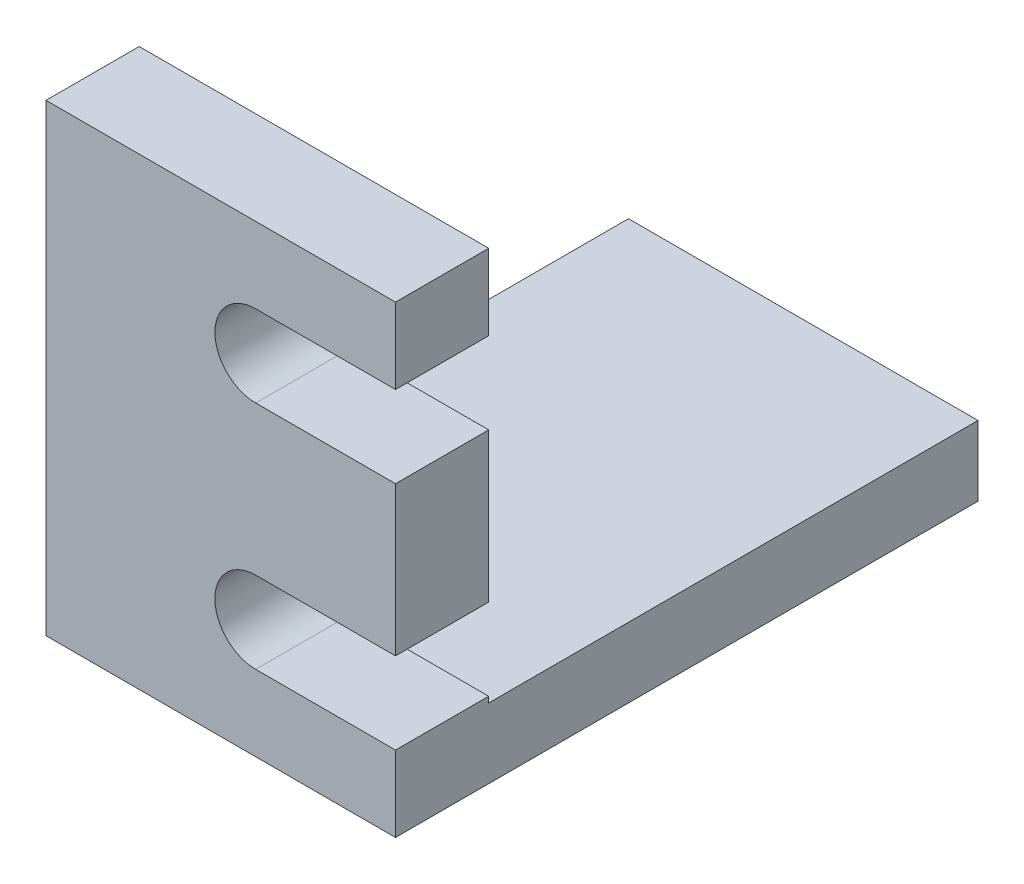
ISO-10303-21;
HEADER;
FILE_DESCRIPTION(('STEP AP214'),'2;1');
FILE_NAME('part.step','',(''),(''),'','','');
FILE_SCHEMA(('AUTOMOTIVE_DESIGN { 1 0 10303 214 1 1 1 1 }'));
ENDSEC;
DATA;
#1=APPLICATION_CONTEXT('core data for automotive mechanical design processes');
#2=APPLICATION_PROTOCOL_DEFINITION('international standard','automotive_design',2000,#1);
#3=PRODUCT_CONTEXT('',#1,'mechanical');
#4=PRODUCT('Part','Part','',(#3));
#5=PRODUCT_RELATED_PRODUCT_CATEGORY('part','',(#4));
#6=PRODUCT_DEFINITION_FORMATION('','',#4);
#7=PRODUCT_DEFINITION_CONTEXT('part definition',#1,'design');
#8=PRODUCT_DEFINITION('design','',#6,#7);
#9=PRODUCT_DEFINITION_SHAPE('','',#8);
#10=(LENGTH_UNIT() NAMED_UNIT(*) SI_UNIT(.MILLI.,.METRE.));
#11=(NAMED_UNIT(*) PLANE_ANGLE_UNIT() SI_UNIT($,.RADIAN.));
#12=(NAMED_UNIT(*) SI_UNIT($,.STERADIAN.) SOLID_ANGLE_UNIT());
#13=UNCERTAINTY_MEASURE_WITH_UNIT(LENGTH_MEASURE(1.E-05),#10,'distance_accuracy_value','');
#14=(GEOMETRIC_REPRESENTATION_CONTEXT(3) GLOBAL_UNCERTAINTY_ASSIGNED_CONTEXT((#13)) GLOBAL_UNIT_ASSIGNED_CONTEXT((#10,
#11,#12)) REPRESENTATION_CONTEXT('',''));
#15=CARTESIAN_POINT('',(0.,0.,0.));
#16=DIRECTION('',(0.,0.,1.));
#17=DIRECTION('',(1.,0.,0.));
#18=AXIS2_PLACEMENT_3D('',#15,#16,#17);
#19=CARTESIAN_POINT('',(0.,0.,0.));
#20=DIRECTION('',(0.,0.,1.));
#21=DIRECTION('',(1.,0.,0.));
#22=AXIS2_PLACEMENT_3D('',#19,#20,#21);
#23=PLANE('',#22);
#24=DIRECTION('',(1.,0.,0.));
#25=VECTOR('',#24,1.);
#26=CARTESIAN_POINT('',(15.,3.,0.));
#27=LINE('',#26,#25);
#28=CARTESIAN_POINT('',(0.,3.,0.));
#29=VERTEX_POINT('',#28);
#30=CARTESIAN_POINT('',(15.,3.,0.));
#31=VERTEX_POINT('',#30);
#32=EDGE_CURVE('E55',#29,#31,#27,.T.);
#33=ORIENTED_EDGE('',*,*,#32,.F.);
#34=DIRECTION('',(0.,1.,0.));
#35=VECTOR('',#34,1.);
#36=CARTESIAN_POINT('',(0.,0.,0.));
#37=LINE('',#36,#35);
#38=CARTESIAN_POINT('',(0.,19.9,0.));
#39=VERTEX_POINT('',#38);
#40=EDGE_CURVE('E275',#29,#39,#37,.T.);
#41=ORIENTED_EDGE('',*,*,#40,.T.);
#42=DIRECTION('',(1.,0.,0.));
#43=VECTOR('',#42,1.);
#44=CARTESIAN_POINT('',(0.,19.9,0.));
#45=LINE('',#44,#43);
#46=CARTESIAN_POINT('',(15.,19.9,0.));
#47=VERTEX_POINT('',#46);
#48=EDGE_CURVE('E268',#39,#47,#45,.T.);
#49=ORIENTED_EDGE('',*,*,#48,.T.);
#50=DIRECTION('',(0.,1.,0.));
#51=VECTOR('',#50,1.);
#52=CARTESIAN_POINT('',(15.,0.,0.));
#53=LINE('',#52,#51);
#54=CARTESIAN_POINT('',(15.,16.65,0.));
#55=VERTEX_POINT('',#54);
#56=EDGE_CURVE('E262',#55,#47,#53,.T.);
#57=ORIENTED_EDGE('',*,*,#56,.F.);
#58=DIRECTION('',(1.,0.,0.));
#59=VECTOR('',#58,1.);
#60=CARTESIAN_POINT('',(0.,16.65,0.));
#61=LINE('',#60,#59);
#62=CARTESIAN_POINT('',(9.,16.65,0.));
#63=VERTEX_POINT('',#62);
#64=EDGE_CURVE('E266',#63,#55,#61,.T.);
#65=ORIENTED_EDGE('',*,*,#64,.F.);
#66=CARTESIAN_POINT('',(9.,14.9,0.));
#67=DIRECTION('',(0.,0.,1.));
#68=DIRECTION('',(1.,0.,0.));
#69=AXIS2_PLACEMENT_3D('',#66,#67,#68);
#70=CIRCLE('',#69,1.75);
#71=CARTESIAN_POINT('',(9.,13.15,0.));
#72=VERTEX_POINT('',#71);
#73=EDGE_CURVE('E194',#63,#72,#70,.T.);
#74=ORIENTED_EDGE('',*,*,#73,.T.);
#75=DIRECTION('',(1.,0.,0.));
#76=VECTOR('',#75,1.);
#77=CARTESIAN_POINT('',(0.,13.15,0.));
#78=LINE('',#77,#76);
#79=CARTESIAN_POINT('',(15.,13.15,0.));
#80=VERTEX_POINT('',#79);
#81=EDGE_CURVE('E187',#72,#80,#78,.T.);
#82=ORIENTED_EDGE('',*,*,#81,.T.);
#83=CARTESIAN_POINT('',(15.,6.75,0.));
#84=VERTEX_POINT('',#83);
#85=EDGE_CURVE('E272',#84,#80,#53,.T.);
#86=ORIENTED_EDGE('',*,*,#85,.F.);
#87=DIRECTION('',(1.,0.,0.));
#88=VECTOR('',#87,1.);
#89=CARTESIAN_POINT('',(0.,6.75,0.));
#90=LINE('',#89,#88);
#91=CARTESIAN_POINT('',(9.,6.75,0.));
#92=VERTEX_POINT('',#91);
#93=EDGE_CURVE('E153',#92,#84,#90,.T.);
#94=ORIENTED_EDGE('',*,*,#93,.F.);
#95=CARTESIAN_POINT('',(9.,5.,0.));
#96=DIRECTION('',(0.,0.,1.));
#97=DIRECTION('',(1.,0.,0.));
#98=AXIS2_PLACEMENT_3D('',#95,#96,#97);
#99=CIRCLE('',#98,1.75);
#100=CARTESIAN_POINT('',(9.,3.25,0.));
#101=VERTEX_POINT('',#100);
#102=EDGE_CURVE('E285',#92,#101,#99,.T.);
#103=ORIENTED_EDGE('',*,*,#102,.T.);
#104=DIRECTION('',(1.,0.,0.));
#105=VECTOR('',#104,1.);
#106=CARTESIAN_POINT('',(0.,3.25,0.));
#107=LINE('',#106,#105);
#108=CARTESIAN_POINT('',(15.,3.25,0.));
#109=VERTEX_POINT('',#108);
#110=EDGE_CURVE('E279',#101,#109,#107,.T.);
#111=ORIENTED_EDGE('',*,*,#110,.T.);
#112=EDGE_CURVE('E271',#31,#109,#53,.T.);
#113=ORIENTED_EDGE('',*,*,#112,.F.);
#114=EDGE_LOOP('',(#33,#41,#49,#57,#65,#74,#82,#86,#94,#103,#111,#113));
#115=FACE_BOUND('',#114,.T.);
#116=ADVANCED_FACE('F39',(#115),#23,.F.);
#117=CARTESIAN_POINT('',(9.,14.9,4.));
#118=DIRECTION('',(0.,0.,-1.));
#119=DIRECTION('',(-1.,0.,0.));
#120=AXIS2_PLACEMENT_3D('',#117,#118,#119);
#121=CYLINDRICAL_SURFACE('',#120,1.75);
#122=ORIENTED_EDGE('',*,*,#73,.F.);
#123=DIRECTION('',(0.,0.,-1.));
#124=VECTOR('',#123,1.);
#125=CARTESIAN_POINT('',(9.,16.65,4.));
#126=LINE('',#125,#124);
#127=CARTESIAN_POINT('',(9.,16.65,4.));
#128=VERTEX_POINT('',#127);
#129=EDGE_CURVE('E11',#128,#63,#126,.T.);
#130=ORIENTED_EDGE('',*,*,#129,.F.);
#131=CARTESIAN_POINT('',(9.,14.9,4.));
#132=DIRECTION('',(0.,0.,1.));
#133=DIRECTION('',(1.,0.,0.));
#134=AXIS2_PLACEMENT_3D('',#131,#132,#133);
#135=CIRCLE('',#134,1.75);
#136=CARTESIAN_POINT('',(9.,13.15,4.));
#137=VERTEX_POINT('',#136);
#138=EDGE_CURVE('E184',#128,#137,#135,.T.);
#139=ORIENTED_EDGE('',*,*,#138,.T.);
#140=DIRECTION('',(0.,0.,-1.));
#141=VECTOR('',#140,1.);
#142=CARTESIAN_POINT('',(9.,13.15,4.));
#143=LINE('',#142,#141);
#144=EDGE_CURVE('E64',#137,#72,#143,.T.);
#145=ORIENTED_EDGE('',*,*,#144,.T.);
#146=EDGE_LOOP('',(#122,#130,#139,#145));
#147=FACE_BOUND('',#146,.T.);
#148=ADVANCED_FACE('F41',(#147),#121,.F.);
#149=CARTESIAN_POINT('',(0.,16.65,4.));
#150=DIRECTION('',(0.,1.,0.));
#151=DIRECTION('',(0.,0.,1.));
#152=AXIS2_PLACEMENT_3D('',#149,#150,#151);
#153=PLANE('',#152);
#154=ORIENTED_EDGE('',*,*,#64,.T.);
#155=DIRECTION('',(0.,0.,-1.));
#156=VECTOR('',#155,1.);
#157=CARTESIAN_POINT('',(15.,16.65,4.));
#158=LINE('',#157,#156);
#159=CARTESIAN_POINT('',(15.,16.65,4.));
#160=VERTEX_POINT('',#159);
#161=EDGE_CURVE('E48',#160,#55,#158,.T.);
#162=ORIENTED_EDGE('',*,*,#161,.F.);
#163=DIRECTION('',(1.,0.,0.));
#164=VECTOR('',#163,1.);
#165=CARTESIAN_POINT('',(0.,16.65,4.));
#166=LINE('',#165,#164);
#167=EDGE_CURVE('E176',#128,#160,#166,.T.);
#168=ORIENTED_EDGE('',*,*,#167,.F.);
#169=ORIENTED_EDGE('',*,*,#129,.T.);
#170=EDGE_LOOP('',(#154,#162,#168,#169));
#171=FACE_BOUND('',#170,.T.);
#172=ADVANCED_FACE('F328',(#171),#153,.F.);
#173=CARTESIAN_POINT('',(15.,0.,4.));
#174=DIRECTION('',(-1.,0.,0.));
#175=DIRECTION('',(0.,0.,1.));
#176=AXIS2_PLACEMENT_3D('',#173,#174,#175);
#177=PLANE('',#176);
#178=ORIENTED_EDGE('',*,*,#56,.T.);
#179=DIRECTION('',(0.,0.,-1.));
#180=VECTOR('',#179,1.);
#181=CARTESIAN_POINT('',(15.,19.9,4.));
#182=LINE('',#181,#180);
#183=CARTESIAN_POINT('',(15.,19.9,4.));
#184=VERTEX_POINT('',#183);
#185=EDGE_CURVE('E249',#184,#47,#182,.T.);
#186=ORIENTED_EDGE('',*,*,#185,.F.);
#187=DIRECTION('',(0.,1.,0.));
#188=VECTOR('',#187,1.);
#189=CARTESIAN_POINT('',(15.,0.,4.));
#190=LINE('',#189,#188);
#191=EDGE_CURVE('E166',#160,#184,#190,.T.);
#192=ORIENTED_EDGE('',*,*,#191,.F.);
#193=ORIENTED_EDGE('',*,*,#161,.T.);
#194=EDGE_LOOP('',(#178,#186,#192,#193));
#195=FACE_BOUND('',#194,.T.);
#196=ADVANCED_FACE('F261',(#195),#177,.F.);
#197=CARTESIAN_POINT('',(0.,19.9,4.));
#198=DIRECTION('',(0.,1.,0.));
#199=DIRECTION('',(0.,0.,1.));
#200=AXIS2_PLACEMENT_3D('',#197,#198,#199);
#201=PLANE('',#200);
#202=ORIENTED_EDGE('',*,*,#48,.F.);
#203=DIRECTION('',(0.,0.,-1.));
#204=VECTOR('',#203,1.);
#205=CARTESIAN_POINT('',(0.,19.9,4.));
#206=LINE('',#205,#204);
#207=CARTESIAN_POINT('',(0.,19.9,4.));
#208=VERTEX_POINT('',#207);
#209=EDGE_CURVE('E244',#208,#39,#206,.T.);
#210=ORIENTED_EDGE('',*,*,#209,.F.);
#211=DIRECTION('',(1.,0.,0.));
#212=VECTOR('',#211,1.);
#213=CARTESIAN_POINT('',(0.,19.9,4.));
#214=LINE('',#213,#212);
#215=EDGE_CURVE('E175',#208,#184,#214,.T.);
#216=ORIENTED_EDGE('',*,*,#215,.T.);
#217=ORIENTED_EDGE('',*,*,#185,.T.);
#218=EDGE_LOOP('',(#202,#210,#216,#217));
#219=FACE_BOUND('',#218,.T.);
#220=ADVANCED_FACE('F315',(#219),#201,.T.);
#221=CARTESIAN_POINT('',(0.,0.,4.));
#222=DIRECTION('',(-1.,0.,0.));
#223=DIRECTION('',(0.,0.,1.));
#224=AXIS2_PLACEMENT_3D('',#221,#222,#223);
#225=PLANE('',#224);
#226=ORIENTED_EDGE('',*,*,#40,.F.);
#227=DIRECTION('',(0.,0.,1.));
#228=VECTOR('',#227,1.);
#229=CARTESIAN_POINT('',(0.,3.,-21.));
#230=LINE('',#229,#228);
#231=CARTESIAN_POINT('',(0.,3.,-21.));
#232=VERTEX_POINT('',#231);
#233=EDGE_CURVE('E190',#232,#29,#230,.T.);
#234=ORIENTED_EDGE('',*,*,#233,.F.);
#235=DIRECTION('',(0.,1.,0.));
#236=VECTOR('',#235,1.);
#237=CARTESIAN_POINT('',(0.,0.,-21.));
#238=LINE('',#237,#236);
#239=CARTESIAN_POINT('',(0.,0.,-21.));
#240=VERTEX_POINT('',#239);
#241=EDGE_CURVE('E206',#240,#232,#238,.T.);
#242=ORIENTED_EDGE('',*,*,#241,.F.);
#243=DIRECTION('',(0.,0.,-1.));
#244=VECTOR('',#243,1.);
#245=CARTESIAN_POINT('',(0.,0.,4.));
#246=LINE('',#245,#244);
#247=CARTESIAN_POINT('',(0.,0.,4.));
#248=VERTEX_POINT('',#247);
#249=EDGE_CURVE('E238',#248,#240,#246,.T.);
#250=ORIENTED_EDGE('',*,*,#249,.F.);
#251=DIRECTION('',(0.,1.,0.));
#252=VECTOR('',#251,1.);
#253=CARTESIAN_POINT('',(0.,0.,4.));
#254=LINE('',#253,#252);
#255=EDGE_CURVE('E183',#248,#208,#254,.T.);
#256=ORIENTED_EDGE('',*,*,#255,.T.);
#257=ORIENTED_EDGE('',*,*,#209,.T.);
#258=EDGE_LOOP('',(#226,#234,#242,#250,#256,#257));
#259=FACE_BOUND('',#258,.T.);
#260=ADVANCED_FACE('F313',(#259),#225,.T.);
#261=CARTESIAN_POINT('',(0.,0.,4.));
#262=DIRECTION('',(0.,1.,0.));
#263=DIRECTION('',(-1.,0.,0.));
#264=AXIS2_PLACEMENT_3D('',#261,#262,#263);
#265=PLANE('',#264);
#266=ORIENTED_EDGE('',*,*,#249,.T.);
#267=DIRECTION('',(-1.,0.,0.));
#268=VECTOR('',#267,1.);
#269=CARTESIAN_POINT('',(15.,0.,-21.));
#270=LINE('',#269,#268);
#271=CARTESIAN_POINT('',(15.,0.,-21.));
#272=VERTEX_POINT('',#271);
#273=EDGE_CURVE('E210',#272,#240,#270,.T.);
#274=ORIENTED_EDGE('',*,*,#273,.F.);
#275=DIRECTION('',(0.,0.,-1.));
#276=VECTOR('',#275,1.);
#277=CARTESIAN_POINT('',(15.,0.,4.));
#278=LINE('',#277,#276);
#279=CARTESIAN_POINT('',(15.,0.,4.));
#280=VERTEX_POINT('',#279);
#281=EDGE_CURVE('E231',#280,#272,#278,.T.);
#282=ORIENTED_EDGE('',*,*,#281,.F.);
#283=DIRECTION('',(1.,0.,0.));
#284=VECTOR('',#283,1.);
#285=CARTESIAN_POINT('',(0.,0.,4.));
#286=LINE('',#285,#284);
#287=EDGE_CURVE('E173',#248,#280,#286,.T.);
#288=ORIENTED_EDGE('',*,*,#287,.F.);
#289=EDGE_LOOP('',(#266,#274,#282,#288));
#290=FACE_BOUND('',#289,.T.);
#291=ADVANCED_FACE('F239',(#290),#265,.F.);
#292=ORIENTED_EDGE('',*,*,#281,.T.);
#293=DIRECTION('',(0.,-1.,0.));
#294=VECTOR('',#293,1.);
#295=CARTESIAN_POINT('',(15.,0.,-21.));
#296=LINE('',#295,#294);
#297=CARTESIAN_POINT('',(15.,3.,-21.));
#298=VERTEX_POINT('',#297);
#299=EDGE_CURVE('E202',#298,#272,#296,.T.);
#300=ORIENTED_EDGE('',*,*,#299,.F.);
#301=DIRECTION('',(0.,0.,1.));
#302=VECTOR('',#301,1.);
#303=CARTESIAN_POINT('',(15.,3.,-21.));
#304=LINE('',#303,#302);
#305=EDGE_CURVE('E195',#298,#31,#304,.T.);
#306=ORIENTED_EDGE('',*,*,#305,.T.);
#307=ORIENTED_EDGE('',*,*,#112,.T.);
#308=DIRECTION('',(0.,0.,-1.));
#309=VECTOR('',#308,1.);
#310=CARTESIAN_POINT('',(15.,3.25,4.));
#311=LINE('',#310,#309);
#312=CARTESIAN_POINT('',(15.,3.25,4.));
#313=VERTEX_POINT('',#312);
#314=EDGE_CURVE('E251',#313,#109,#311,.T.);
#315=ORIENTED_EDGE('',*,*,#314,.F.);
#316=EDGE_CURVE('E165',#280,#313,#190,.T.);
#317=ORIENTED_EDGE('',*,*,#316,.F.);
#318=EDGE_LOOP('',(#292,#300,#306,#307,#315,#317));
#319=FACE_BOUND('',#318,.T.);
#320=ADVANCED_FACE('F228',(#319),#177,.F.);
#321=CARTESIAN_POINT('',(0.,3.25,4.));
#322=DIRECTION('',(0.,1.,0.));
#323=DIRECTION('',(-1.,0.,0.));
#324=AXIS2_PLACEMENT_3D('',#321,#322,#323);
#325=PLANE('',#324);
#326=ORIENTED_EDGE('',*,*,#110,.F.);
#327=DIRECTION('',(0.,0.,-1.));
#328=VECTOR('',#327,1.);
#329=CARTESIAN_POINT('',(9.,3.25,4.));
#330=LINE('',#329,#328);
#331=CARTESIAN_POINT('',(9.,3.25,4.));
#332=VERTEX_POINT('',#331);
#333=EDGE_CURVE('E298',#332,#101,#330,.T.);
#334=ORIENTED_EDGE('',*,*,#333,.F.);
#335=DIRECTION('',(1.,0.,0.));
#336=VECTOR('',#335,1.);
#337=CARTESIAN_POINT('',(0.,3.25,4.));
#338=LINE('',#337,#336);
#339=EDGE_CURVE('E172',#332,#313,#338,.T.);
#340=ORIENTED_EDGE('',*,*,#339,.T.);
#341=ORIENTED_EDGE('',*,*,#314,.T.);
#342=EDGE_LOOP('',(#326,#334,#340,#341));
#343=FACE_BOUND('',#342,.T.);
#344=ADVANCED_FACE('F307',(#343),#325,.T.);
#345=CARTESIAN_POINT('',(9.,5.,4.));
#346=DIRECTION('',(0.,0.,-1.));
#347=DIRECTION('',(-1.,0.,0.));
#348=AXIS2_PLACEMENT_3D('',#345,#346,#347);
#349=CYLINDRICAL_SURFACE('',#348,1.75);
#350=ORIENTED_EDGE('',*,*,#102,.F.);
#351=DIRECTION('',(0.,0.,-1.));
#352=VECTOR('',#351,1.);
#353=CARTESIAN_POINT('',(9.,6.75,4.));
#354=LINE('',#353,#352);
#355=CARTESIAN_POINT('',(9.,6.75,4.));
#356=VERTEX_POINT('',#355);
#357=EDGE_CURVE('E158',#356,#92,#354,.T.);
#358=ORIENTED_EDGE('',*,*,#357,.F.);
#359=CARTESIAN_POINT('',(9.,5.,4.));
#360=DIRECTION('',(0.,0.,1.));
#361=DIRECTION('',(1.,0.,0.));
#362=AXIS2_PLACEMENT_3D('',#359,#360,#361);
#363=CIRCLE('',#362,1.75);
#364=EDGE_CURVE('E145',#356,#332,#363,.T.);
#365=ORIENTED_EDGE('',*,*,#364,.T.);
#366=ORIENTED_EDGE('',*,*,#333,.T.);
#367=EDGE_LOOP('',(#350,#358,#365,#366));
#368=FACE_BOUND('',#367,.T.);
#369=ADVANCED_FACE('F345',(#368),#349,.F.);
#370=CARTESIAN_POINT('',(0.,6.75,4.));
#371=DIRECTION('',(0.,1.,0.));
#372=DIRECTION('',(-1.,0.,0.));
#373=AXIS2_PLACEMENT_3D('',#370,#371,#372);
#374=PLANE('',#373);
#375=ORIENTED_EDGE('',*,*,#93,.T.);
#376=DIRECTION('',(0.,0.,-1.));
#377=VECTOR('',#376,1.);
#378=CARTESIAN_POINT('',(15.,6.75,4.));
#379=LINE('',#378,#377);
#380=CARTESIAN_POINT('',(15.,6.75,4.));
#381=VERTEX_POINT('',#380);
#382=EDGE_CURVE('E150',#381,#84,#379,.T.);
#383=ORIENTED_EDGE('',*,*,#382,.F.);
#384=DIRECTION('',(1.,0.,0.));
#385=VECTOR('',#384,1.);
#386=CARTESIAN_POINT('',(0.,6.75,4.));
#387=LINE('',#386,#385);
#388=EDGE_CURVE('E135',#356,#381,#387,.T.);
#389=ORIENTED_EDGE('',*,*,#388,.F.);
#390=ORIENTED_EDGE('',*,*,#357,.T.);
#391=EDGE_LOOP('',(#375,#383,#389,#390));
#392=FACE_BOUND('',#391,.T.);
#393=ADVANCED_FACE('F151',(#392),#374,.F.);
#394=ORIENTED_EDGE('',*,*,#85,.T.);
#395=DIRECTION('',(0.,0.,-1.));
#396=VECTOR('',#395,1.);
#397=CARTESIAN_POINT('',(15.,13.15,4.));
#398=LINE('',#397,#396);
#399=CARTESIAN_POINT('',(15.,13.15,4.));
#400=VERTEX_POINT('',#399);
#401=EDGE_CURVE('E159',#400,#80,#398,.T.);
#402=ORIENTED_EDGE('',*,*,#401,.F.);
#403=EDGE_CURVE('E141',#381,#400,#190,.T.);
#404=ORIENTED_EDGE('',*,*,#403,.F.);
#405=ORIENTED_EDGE('',*,*,#382,.T.);
#406=EDGE_LOOP('',(#394,#402,#404,#405));
#407=FACE_BOUND('',#406,.T.);
#408=ADVANCED_FACE('F161',(#407),#177,.F.);
#409=CARTESIAN_POINT('',(0.,13.15,4.));
#410=DIRECTION('',(0.,1.,0.));
#411=DIRECTION('',(-1.,0.,0.));
#412=AXIS2_PLACEMENT_3D('',#409,#410,#411);
#413=PLANE('',#412);
#414=ORIENTED_EDGE('',*,*,#81,.F.);
#415=ORIENTED_EDGE('',*,*,#144,.F.);
#416=DIRECTION('',(1.,0.,0.));
#417=VECTOR('',#416,1.);
#418=CARTESIAN_POINT('',(0.,13.15,4.));
#419=LINE('',#418,#417);
#420=EDGE_CURVE('E163',#137,#400,#419,.T.);
#421=ORIENTED_EDGE('',*,*,#420,.T.);
#422=ORIENTED_EDGE('',*,*,#401,.T.);
#423=EDGE_LOOP('',(#414,#415,#421,#422));
#424=FACE_BOUND('',#423,.T.);
#425=ADVANCED_FACE('F326',(#424),#413,.T.);
#426=CARTESIAN_POINT('',(0.,0.,4.));
#427=DIRECTION('',(0.,0.,1.));
#428=DIRECTION('',(1.,0.,0.));
#429=AXIS2_PLACEMENT_3D('',#426,#427,#428);
#430=PLANE('',#429);
#431=ORIENTED_EDGE('',*,*,#138,.F.);
#432=ORIENTED_EDGE('',*,*,#167,.T.);
#433=ORIENTED_EDGE('',*,*,#191,.T.);
#434=ORIENTED_EDGE('',*,*,#215,.F.);
#435=ORIENTED_EDGE('',*,*,#255,.F.);
#436=ORIENTED_EDGE('',*,*,#287,.T.);
#437=ORIENTED_EDGE('',*,*,#316,.T.);
#438=ORIENTED_EDGE('',*,*,#339,.F.);
#439=ORIENTED_EDGE('',*,*,#364,.F.);
#440=ORIENTED_EDGE('',*,*,#388,.T.);
#441=ORIENTED_EDGE('',*,*,#403,.T.);
#442=ORIENTED_EDGE('',*,*,#420,.F.);
#443=EDGE_LOOP('',(#431,#432,#433,#434,#435,#436,#437,#438,#439,#440,#441,#442));
#444=FACE_BOUND('',#443,.T.);
#445=ADVANCED_FACE('F138',(#444),#430,.T.);
#446=CARTESIAN_POINT('',(15.,3.,-21.));
#447=DIRECTION('',(0.,-1.,0.));
#448=DIRECTION('',(0.,0.,-1.));
#449=AXIS2_PLACEMENT_3D('',#446,#447,#448);
#450=PLANE('',#449);
#451=ORIENTED_EDGE('',*,*,#32,.T.);
#452=ORIENTED_EDGE('',*,*,#305,.F.);
#453=DIRECTION('',(1.,0.,0.));
#454=VECTOR('',#453,1.);
#455=CARTESIAN_POINT('',(15.,3.,-21.));
#456=LINE('',#455,#454);
#457=EDGE_CURVE('E199',#232,#298,#456,.T.);
#458=ORIENTED_EDGE('',*,*,#457,.F.);
#459=ORIENTED_EDGE('',*,*,#233,.T.);
#460=EDGE_LOOP('',(#451,#452,#458,#459));
#461=FACE_BOUND('',#460,.T.);
#462=ADVANCED_FACE('F393',(#461),#450,.F.);
#463=CARTESIAN_POINT('',(0.,0.,-21.));
#464=DIRECTION('',(0.,0.,1.));
#465=DIRECTION('',(1.,0.,0.));
#466=AXIS2_PLACEMENT_3D('',#463,#464,#465);
#467=PLANE('',#466);
#468=ORIENTED_EDGE('',*,*,#299,.T.);
#469=ORIENTED_EDGE('',*,*,#273,.T.);
#470=ORIENTED_EDGE('',*,*,#241,.T.);
#471=ORIENTED_EDGE('',*,*,#457,.T.);
#472=EDGE_LOOP('',(#468,#469,#470,#471));
#473=FACE_BOUND('',#472,.T.);
#474=ADVANCED_FACE('F219',(#473),#467,.F.);
#475=CLOSED_SHELL('',(#116,#148,#172,#196,#220,#260,#291,#320,#344,#369,#393,#408,#425,#445,
#462,#474));
#476=MANIFOLD_SOLID_BREP('B2',#475);
#477=ADVANCED_BREP_SHAPE_REPRESENTATION('',(#18,#476),#14);
#478=SHAPE_DEFINITION_REPRESENTATION(#9,#477);
ENDSEC;
END-ISO-10303-21;
